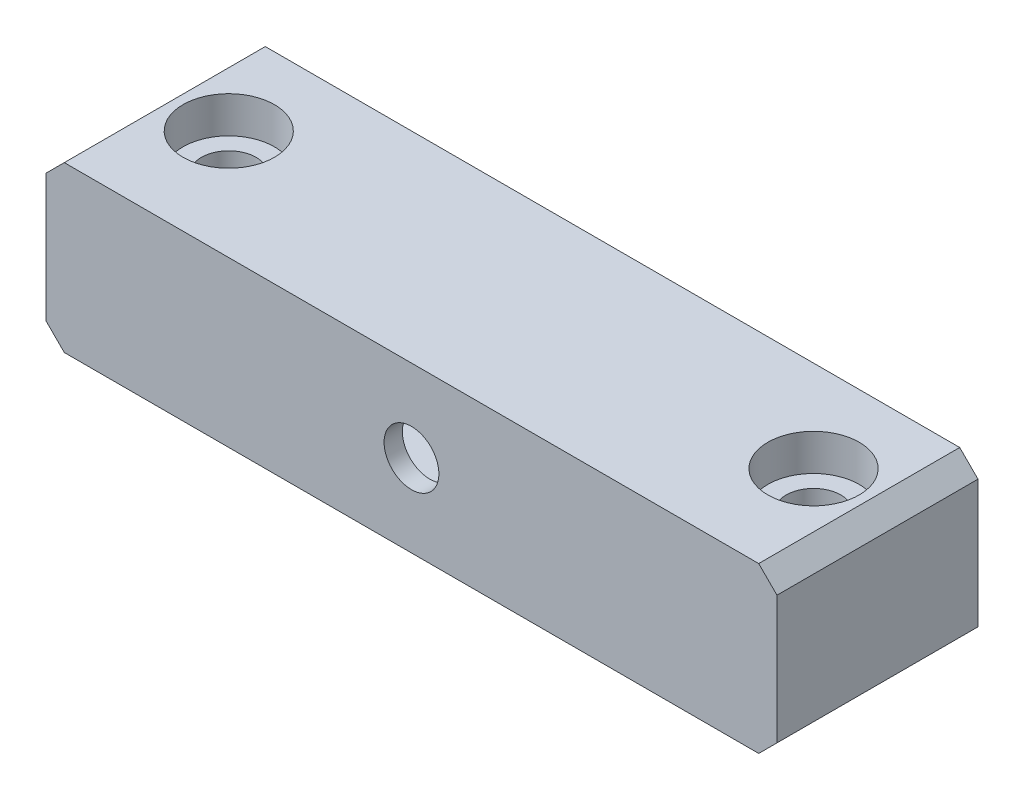
ISO-10303-21;
HEADER;
FILE_DESCRIPTION(('STEP AP214'),'2;1');
FILE_NAME('part.step','',(''),(''),'','','');
FILE_SCHEMA(('AUTOMOTIVE_DESIGN { 1 0 10303 214 1 1 1 1 }'));
ENDSEC;
DATA;
#1=APPLICATION_CONTEXT('core data for automotive mechanical design processes');
#2=APPLICATION_PROTOCOL_DEFINITION('international standard','automotive_design',2000,#1);
#3=PRODUCT_CONTEXT('',#1,'mechanical');
#4=PRODUCT('Part','Part','',(#3));
#5=PRODUCT_RELATED_PRODUCT_CATEGORY('part','',(#4));
#6=PRODUCT_DEFINITION_FORMATION('','',#4);
#7=PRODUCT_DEFINITION_CONTEXT('part definition',#1,'design');
#8=PRODUCT_DEFINITION('design','',#6,#7);
#9=PRODUCT_DEFINITION_SHAPE('','',#8);
#10=(LENGTH_UNIT() NAMED_UNIT(*) SI_UNIT(.MILLI.,.METRE.));
#11=(NAMED_UNIT(*) PLANE_ANGLE_UNIT() SI_UNIT($,.RADIAN.));
#12=(NAMED_UNIT(*) SI_UNIT($,.STERADIAN.) SOLID_ANGLE_UNIT());
#13=UNCERTAINTY_MEASURE_WITH_UNIT(LENGTH_MEASURE(1.E-05),#10,'distance_accuracy_value','');
#14=(GEOMETRIC_REPRESENTATION_CONTEXT(3) GLOBAL_UNCERTAINTY_ASSIGNED_CONTEXT((#13)) GLOBAL_UNIT_ASSIGNED_CONTEXT((#10,
#11,#12)) REPRESENTATION_CONTEXT('',''));
#15=CARTESIAN_POINT('',(0.,0.,0.));
#16=DIRECTION('',(0.,0.,1.));
#17=DIRECTION('',(1.,0.,0.));
#18=AXIS2_PLACEMENT_3D('',#15,#16,#17);
#19=CARTESIAN_POINT('',(0.,0.,-5.));
#20=DIRECTION('',(0.,0.,1.));
#21=DIRECTION('',(1.,0.,0.));
#22=AXIS2_PLACEMENT_3D('',#19,#20,#21);
#23=PLANE('',#22);
#24=DIRECTION('',(1.,0.,0.));
#25=VECTOR('',#24,1.);
#26=CARTESIAN_POINT('',(10.,-4.5,-5.));
#27=LINE('',#26,#25);
#28=CARTESIAN_POINT('',(-19.,-4.5,-5.));
#29=VERTEX_POINT('',#28);
#30=CARTESIAN_POINT('',(19.,-4.5,-5.));
#31=VERTEX_POINT('',#30);
#32=EDGE_CURVE('E183',#29,#31,#27,.T.);
#33=ORIENTED_EDGE('',*,*,#32,.F.);
#34=DIRECTION('',(0.707106781186546,-0.707106781186549,0.));
#35=VECTOR('',#34,1.);
#36=CARTESIAN_POINT('',(-19.,-4.5,-5.));
#37=LINE('',#36,#35);
#38=CARTESIAN_POINT('',(-20.,-3.49999999999999,-5.));
#39=VERTEX_POINT('',#38);
#40=EDGE_CURVE('E210',#29,#39,#37,.F.);
#41=ORIENTED_EDGE('',*,*,#40,.T.);
#42=DIRECTION('',(0.,-1.,0.));
#43=VECTOR('',#42,1.);
#44=CARTESIAN_POINT('',(-20.,4.5,-5.));
#45=LINE('',#44,#43);
#46=CARTESIAN_POINT('',(-20.,3.5,-5.));
#47=VERTEX_POINT('',#46);
#48=EDGE_CURVE('E175',#47,#39,#45,.T.);
#49=ORIENTED_EDGE('',*,*,#48,.F.);
#50=DIRECTION('',(-0.707106781186549,-0.707106781186546,0.));
#51=VECTOR('',#50,1.);
#52=CARTESIAN_POINT('',(-20.,3.5,-5.));
#53=LINE('',#52,#51);
#54=CARTESIAN_POINT('',(-19.,4.5,-5.));
#55=VERTEX_POINT('',#54);
#56=EDGE_CURVE('E204',#47,#55,#53,.F.);
#57=ORIENTED_EDGE('',*,*,#56,.T.);
#58=DIRECTION('',(-1.,0.,0.));
#59=VECTOR('',#58,1.);
#60=CARTESIAN_POINT('',(-10.,4.5,-5.));
#61=LINE('',#60,#59);
#62=CARTESIAN_POINT('',(19.,4.5,-5.));
#63=VERTEX_POINT('',#62);
#64=EDGE_CURVE('E189',#63,#55,#61,.T.);
#65=ORIENTED_EDGE('',*,*,#64,.F.);
#66=DIRECTION('',(-0.707106781186545,0.70710678118655,0.));
#67=VECTOR('',#66,1.);
#68=CARTESIAN_POINT('',(19.,4.5,-5.));
#69=LINE('',#68,#67);
#70=CARTESIAN_POINT('',(20.,3.5,-5.));
#71=VERTEX_POINT('',#70);
#72=EDGE_CURVE('E206',#63,#71,#69,.F.);
#73=ORIENTED_EDGE('',*,*,#72,.T.);
#74=DIRECTION('',(0.,1.,0.));
#75=VECTOR('',#74,1.);
#76=CARTESIAN_POINT('',(20.,-4.5,-5.));
#77=LINE('',#76,#75);
#78=CARTESIAN_POINT('',(20.,-3.50000000000001,-5.));
#79=VERTEX_POINT('',#78);
#80=EDGE_CURVE('E186',#79,#71,#77,.T.);
#81=ORIENTED_EDGE('',*,*,#80,.F.);
#82=DIRECTION('',(0.707106781186549,0.707106781186546,0.));
#83=VECTOR('',#82,1.);
#84=CARTESIAN_POINT('',(20.,-3.50000000000001,-5.));
#85=LINE('',#84,#83);
#86=EDGE_CURVE('E208',#79,#31,#85,.F.);
#87=ORIENTED_EDGE('',*,*,#86,.T.);
#88=EDGE_LOOP('',(#33,#41,#49,#57,#65,#73,#81,#87));
#89=FACE_BOUND('',#88,.T.);
#90=CARTESIAN_POINT('',(-10.,0.,-5.));
#91=DIRECTION('',(0.,0.,1.));
#92=DIRECTION('',(-1.,0.,0.));
#93=AXIS2_PLACEMENT_3D('',#90,#91,#92);
#94=CIRCLE('',#93,3.5);
#95=CARTESIAN_POINT('',(-10.,3.5,-5.));
#96=VERTEX_POINT('',#95);
#97=CARTESIAN_POINT('',(-10.,-3.5,-5.));
#98=VERTEX_POINT('',#97);
#99=EDGE_CURVE('E258',#96,#98,#94,.T.);
#100=ORIENTED_EDGE('',*,*,#99,.T.);
#101=DIRECTION('',(1.,0.,0.));
#102=VECTOR('',#101,1.);
#103=CARTESIAN_POINT('',(10.,-3.5,-5.));
#104=LINE('',#103,#102);
#105=CARTESIAN_POINT('',(10.,-3.5,-5.));
#106=VERTEX_POINT('',#105);
#107=EDGE_CURVE('E264',#98,#106,#104,.T.);
#108=ORIENTED_EDGE('',*,*,#107,.T.);
#109=CARTESIAN_POINT('',(10.,0.,-5.));
#110=DIRECTION('',(0.,0.,1.));
#111=DIRECTION('',(-1.,0.,0.));
#112=AXIS2_PLACEMENT_3D('',#109,#110,#111);
#113=CIRCLE('',#112,3.5);
#114=CARTESIAN_POINT('',(10.,3.5,-5.));
#115=VERTEX_POINT('',#114);
#116=EDGE_CURVE('E171',#106,#115,#113,.T.);
#117=ORIENTED_EDGE('',*,*,#116,.T.);
#118=DIRECTION('',(-1.,0.,0.));
#119=VECTOR('',#118,1.);
#120=CARTESIAN_POINT('',(-10.,3.5,-5.));
#121=LINE('',#120,#119);
#122=EDGE_CURVE('E259',#115,#96,#121,.T.);
#123=ORIENTED_EDGE('',*,*,#122,.T.);
#124=EDGE_LOOP('',(#100,#108,#117,#123));
#125=FACE_BOUND('',#124,.T.);
#126=ADVANCED_FACE('F59',(#89,#125),#23,.F.);
#127=CARTESIAN_POINT('',(-20.,4.5,5.));
#128=DIRECTION('',(1.,0.,0.));
#129=DIRECTION('',(0.,1.,0.));
#130=AXIS2_PLACEMENT_3D('',#127,#128,#129);
#131=PLANE('',#130);
#132=ORIENTED_EDGE('',*,*,#48,.T.);
#133=DIRECTION('',(0.,0.,1.));
#134=VECTOR('',#133,1.);
#135=CARTESIAN_POINT('',(-20.,-3.49999999999999,5.));
#136=LINE('',#135,#134);
#137=CARTESIAN_POINT('',(-20.,-3.49999999999999,6.));
#138=VERTEX_POINT('',#137);
#139=EDGE_CURVE('E215',#39,#138,#136,.T.);
#140=ORIENTED_EDGE('',*,*,#139,.T.);
#141=DIRECTION('',(0.,-1.,0.));
#142=VECTOR('',#141,1.);
#143=CARTESIAN_POINT('',(-20.,0.,6.));
#144=LINE('',#143,#142);
#145=CARTESIAN_POINT('',(-20.,3.5,6.));
#146=VERTEX_POINT('',#145);
#147=EDGE_CURVE('E247',#146,#138,#144,.T.);
#148=ORIENTED_EDGE('',*,*,#147,.F.);
#149=DIRECTION('',(0.,0.,-1.));
#150=VECTOR('',#149,1.);
#151=CARTESIAN_POINT('',(-20.,3.5,5.));
#152=LINE('',#151,#150);
#153=EDGE_CURVE('E212',#146,#47,#152,.T.);
#154=ORIENTED_EDGE('',*,*,#153,.T.);
#155=EDGE_LOOP('',(#132,#140,#148,#154));
#156=FACE_BOUND('',#155,.T.);
#157=ADVANCED_FACE('F286',(#156),#131,.F.);
#158=CARTESIAN_POINT('',(10.,-4.5,5.));
#159=DIRECTION('',(0.,1.,0.));
#160=DIRECTION('',(-1.,0.,0.));
#161=AXIS2_PLACEMENT_3D('',#158,#159,#160);
#162=PLANE('',#161);
#163=CARTESIAN_POINT('',(-16.,-4.5,0.));
#164=DIRECTION('',(0.,1.,0.));
#165=DIRECTION('',(0.,0.,1.));
#166=AXIS2_PLACEMENT_3D('',#163,#164,#165);
#167=CIRCLE('',#166,1.5);
#168=CARTESIAN_POINT('',(-16.,-4.5,1.5));
#169=VERTEX_POINT('',#168);
#170=EDGE_CURVE('E196',#169,#169,#167,.T.);
#171=ORIENTED_EDGE('',*,*,#170,.T.);
#172=EDGE_LOOP('',(#171));
#173=FACE_BOUND('',#172,.T.);
#174=CARTESIAN_POINT('',(16.,-4.5,0.));
#175=DIRECTION('',(0.,1.,0.));
#176=DIRECTION('',(0.,0.,1.));
#177=AXIS2_PLACEMENT_3D('',#174,#175,#176);
#178=CIRCLE('',#177,1.5);
#179=CARTESIAN_POINT('',(16.,-4.5,1.5));
#180=VERTEX_POINT('',#179);
#181=EDGE_CURVE('E468',#180,#180,#178,.T.);
#182=ORIENTED_EDGE('',*,*,#181,.T.);
#183=EDGE_LOOP('',(#182));
#184=FACE_BOUND('',#183,.T.);
#185=DIRECTION('',(1.,0.,0.));
#186=VECTOR('',#185,1.);
#187=CARTESIAN_POINT('',(0.,-4.5,6.));
#188=LINE('',#187,#186);
#189=CARTESIAN_POINT('',(-19.,-4.5,6.));
#190=VERTEX_POINT('',#189);
#191=CARTESIAN_POINT('',(19.,-4.5,6.));
#192=VERTEX_POINT('',#191);
#193=EDGE_CURVE('E250',#190,#192,#188,.T.);
#194=ORIENTED_EDGE('',*,*,#193,.F.);
#195=DIRECTION('',(0.,0.,-1.));
#196=VECTOR('',#195,1.);
#197=CARTESIAN_POINT('',(-19.,-4.5,5.));
#198=LINE('',#197,#196);
#199=EDGE_CURVE('E201',#190,#29,#198,.T.);
#200=ORIENTED_EDGE('',*,*,#199,.T.);
#201=ORIENTED_EDGE('',*,*,#32,.T.);
#202=DIRECTION('',(0.,0.,1.));
#203=VECTOR('',#202,1.);
#204=CARTESIAN_POINT('',(19.,-4.5,5.));
#205=LINE('',#204,#203);
#206=EDGE_CURVE('E191',#31,#192,#205,.T.);
#207=ORIENTED_EDGE('',*,*,#206,.T.);
#208=EDGE_LOOP('',(#194,#200,#201,#207));
#209=FACE_BOUND('',#208,.T.);
#210=ADVANCED_FACE('F290',(#173,#184,#209),#162,.F.);
#211=CARTESIAN_POINT('',(20.,-4.5,5.));
#212=DIRECTION('',(-1.,0.,0.));
#213=DIRECTION('',(0.,-1.,0.));
#214=AXIS2_PLACEMENT_3D('',#211,#212,#213);
#215=PLANE('',#214);
#216=DIRECTION('',(0.,1.,0.));
#217=VECTOR('',#216,1.);
#218=CARTESIAN_POINT('',(20.,0.,6.));
#219=LINE('',#218,#217);
#220=CARTESIAN_POINT('',(20.,-3.50000000000001,6.));
#221=VERTEX_POINT('',#220);
#222=CARTESIAN_POINT('',(20.,3.5,6.));
#223=VERTEX_POINT('',#222);
#224=EDGE_CURVE('E234',#221,#223,#219,.T.);
#225=ORIENTED_EDGE('',*,*,#224,.F.);
#226=DIRECTION('',(0.,0.,-1.));
#227=VECTOR('',#226,1.);
#228=CARTESIAN_POINT('',(20.,-3.50000000000001,5.));
#229=LINE('',#228,#227);
#230=EDGE_CURVE('E226',#221,#79,#229,.T.);
#231=ORIENTED_EDGE('',*,*,#230,.T.);
#232=ORIENTED_EDGE('',*,*,#80,.T.);
#233=DIRECTION('',(0.,0.,1.));
#234=VECTOR('',#233,1.);
#235=CARTESIAN_POINT('',(20.,3.5,5.));
#236=LINE('',#235,#234);
#237=EDGE_CURVE('E224',#71,#223,#236,.T.);
#238=ORIENTED_EDGE('',*,*,#237,.T.);
#239=EDGE_LOOP('',(#225,#231,#232,#238));
#240=FACE_BOUND('',#239,.T.);
#241=ADVANCED_FACE('F232',(#240),#215,.F.);
#242=CARTESIAN_POINT('',(-10.,4.5,5.));
#243=DIRECTION('',(0.,-1.,0.));
#244=DIRECTION('',(0.,0.,-1.));
#245=AXIS2_PLACEMENT_3D('',#242,#243,#244);
#246=PLANE('',#245);
#247=CARTESIAN_POINT('',(16.,4.5,0.));
#248=DIRECTION('',(0.,1.,0.));
#249=DIRECTION('',(0.,0.,1.));
#250=AXIS2_PLACEMENT_3D('',#247,#248,#249);
#251=CIRCLE('',#250,2.5);
#252=CARTESIAN_POINT('',(16.,4.5,2.5));
#253=VERTEX_POINT('',#252);
#254=EDGE_CURVE('E477',#253,#253,#251,.T.);
#255=ORIENTED_EDGE('',*,*,#254,.F.);
#256=EDGE_LOOP('',(#255));
#257=FACE_BOUND('',#256,.T.);
#258=CARTESIAN_POINT('',(-16.,4.5,0.));
#259=DIRECTION('',(0.,1.,0.));
#260=DIRECTION('',(0.,0.,1.));
#261=AXIS2_PLACEMENT_3D('',#258,#259,#260);
#262=CIRCLE('',#261,2.5);
#263=CARTESIAN_POINT('',(-16.,4.5,2.5));
#264=VERTEX_POINT('',#263);
#265=EDGE_CURVE('E480',#264,#264,#262,.T.);
#266=ORIENTED_EDGE('',*,*,#265,.F.);
#267=EDGE_LOOP('',(#266));
#268=FACE_BOUND('',#267,.T.);
#269=DIRECTION('',(-1.,0.,0.));
#270=VECTOR('',#269,1.);
#271=CARTESIAN_POINT('',(0.,4.50000000000001,6.));
#272=LINE('',#271,#270);
#273=CARTESIAN_POINT('',(19.,4.5,6.));
#274=VERTEX_POINT('',#273);
#275=CARTESIAN_POINT('',(-19.,4.50000000000002,6.));
#276=VERTEX_POINT('',#275);
#277=EDGE_CURVE('E245',#274,#276,#272,.T.);
#278=ORIENTED_EDGE('',*,*,#277,.F.);
#279=DIRECTION('',(0.,0.,-1.));
#280=VECTOR('',#279,1.);
#281=CARTESIAN_POINT('',(19.,4.5,5.));
#282=LINE('',#281,#280);
#283=EDGE_CURVE('E14',#274,#63,#282,.T.);
#284=ORIENTED_EDGE('',*,*,#283,.T.);
#285=ORIENTED_EDGE('',*,*,#64,.T.);
#286=DIRECTION('',(0.,0.,1.));
#287=VECTOR('',#286,1.);
#288=CARTESIAN_POINT('',(-19.,4.5,5.));
#289=LINE('',#288,#287);
#290=EDGE_CURVE('E68',#55,#276,#289,.T.);
#291=ORIENTED_EDGE('',*,*,#290,.T.);
#292=EDGE_LOOP('',(#278,#284,#285,#291));
#293=FACE_BOUND('',#292,.T.);
#294=ADVANCED_FACE('F244',(#257,#268,#293),#246,.F.);
#295=CARTESIAN_POINT('',(-10.,0.,5.));
#296=DIRECTION('',(0.,0.,-1.));
#297=DIRECTION('',(-1.,0.,0.));
#298=AXIS2_PLACEMENT_3D('',#295,#296,#297);
#299=CYLINDRICAL_SURFACE('',#298,3.5);
#300=ORIENTED_EDGE('',*,*,#99,.F.);
#301=DIRECTION('',(0.,0.,-1.));
#302=VECTOR('',#301,1.);
#303=CARTESIAN_POINT('',(-10.,3.5,5.));
#304=LINE('',#303,#302);
#305=CARTESIAN_POINT('',(-10.,3.5,5.));
#306=VERTEX_POINT('',#305);
#307=EDGE_CURVE('E177',#306,#96,#304,.T.);
#308=ORIENTED_EDGE('',*,*,#307,.F.);
#309=CARTESIAN_POINT('',(-10.,0.,5.));
#310=DIRECTION('',(0.,0.,1.));
#311=DIRECTION('',(-1.,0.,0.));
#312=AXIS2_PLACEMENT_3D('',#309,#310,#311);
#313=CIRCLE('',#312,3.5);
#314=CARTESIAN_POINT('',(-10.,-3.5,5.));
#315=VERTEX_POINT('',#314);
#316=EDGE_CURVE('E167',#306,#315,#313,.T.);
#317=ORIENTED_EDGE('',*,*,#316,.T.);
#318=DIRECTION('',(0.,0.,-1.));
#319=VECTOR('',#318,1.);
#320=CARTESIAN_POINT('',(-10.,-3.5,5.));
#321=LINE('',#320,#319);
#322=EDGE_CURVE('E166',#315,#98,#321,.T.);
#323=ORIENTED_EDGE('',*,*,#322,.T.);
#324=EDGE_LOOP('',(#300,#308,#317,#323));
#325=FACE_BOUND('',#324,.T.);
#326=ADVANCED_FACE('F274',(#325),#299,.F.);
#327=CARTESIAN_POINT('',(10.,-3.5,5.));
#328=DIRECTION('',(0.,1.,0.));
#329=DIRECTION('',(0.,0.,1.));
#330=AXIS2_PLACEMENT_3D('',#327,#328,#329);
#331=PLANE('',#330);
#332=ORIENTED_EDGE('',*,*,#107,.F.);
#333=ORIENTED_EDGE('',*,*,#322,.F.);
#334=DIRECTION('',(1.,0.,0.));
#335=VECTOR('',#334,1.);
#336=CARTESIAN_POINT('',(10.,-3.5,5.));
#337=LINE('',#336,#335);
#338=CARTESIAN_POINT('',(10.,-3.5,5.));
#339=VERTEX_POINT('',#338);
#340=EDGE_CURVE('E152',#315,#339,#337,.T.);
#341=ORIENTED_EDGE('',*,*,#340,.T.);
#342=DIRECTION('',(0.,0.,-1.));
#343=VECTOR('',#342,1.);
#344=CARTESIAN_POINT('',(10.,-3.5,5.));
#345=LINE('',#344,#343);
#346=EDGE_CURVE('E163',#339,#106,#345,.T.);
#347=ORIENTED_EDGE('',*,*,#346,.T.);
#348=EDGE_LOOP('',(#332,#333,#341,#347));
#349=FACE_BOUND('',#348,.T.);
#350=ADVANCED_FACE('F162',(#349),#331,.T.);
#351=CARTESIAN_POINT('',(10.,0.,5.));
#352=DIRECTION('',(0.,0.,-1.));
#353=DIRECTION('',(-1.,0.,0.));
#354=AXIS2_PLACEMENT_3D('',#351,#352,#353);
#355=CYLINDRICAL_SURFACE('',#354,3.5);
#356=ORIENTED_EDGE('',*,*,#116,.F.);
#357=ORIENTED_EDGE('',*,*,#346,.F.);
#358=CARTESIAN_POINT('',(10.,0.,5.));
#359=DIRECTION('',(0.,0.,1.));
#360=DIRECTION('',(-1.,0.,0.));
#361=AXIS2_PLACEMENT_3D('',#358,#359,#360);
#362=CIRCLE('',#361,3.5);
#363=CARTESIAN_POINT('',(10.,3.5,5.));
#364=VERTEX_POINT('',#363);
#365=EDGE_CURVE('E149',#339,#364,#362,.T.);
#366=ORIENTED_EDGE('',*,*,#365,.T.);
#367=DIRECTION('',(0.,0.,-1.));
#368=VECTOR('',#367,1.);
#369=CARTESIAN_POINT('',(10.,3.5,5.));
#370=LINE('',#369,#368);
#371=EDGE_CURVE('E173',#364,#115,#370,.T.);
#372=ORIENTED_EDGE('',*,*,#371,.T.);
#373=EDGE_LOOP('',(#356,#357,#366,#372));
#374=FACE_BOUND('',#373,.T.);
#375=ADVANCED_FACE('F169',(#374),#355,.F.);
#376=CARTESIAN_POINT('',(-10.,3.5,5.));
#377=DIRECTION('',(0.,-1.,0.));
#378=DIRECTION('',(1.,0.,0.));
#379=AXIS2_PLACEMENT_3D('',#376,#377,#378);
#380=PLANE('',#379);
#381=ORIENTED_EDGE('',*,*,#122,.F.);
#382=ORIENTED_EDGE('',*,*,#371,.F.);
#383=DIRECTION('',(-1.,0.,0.));
#384=VECTOR('',#383,1.);
#385=CARTESIAN_POINT('',(-10.,3.5,5.));
#386=LINE('',#385,#384);
#387=EDGE_CURVE('E155',#364,#306,#386,.T.);
#388=ORIENTED_EDGE('',*,*,#387,.T.);
#389=ORIENTED_EDGE('',*,*,#307,.T.);
#390=EDGE_LOOP('',(#381,#382,#388,#389));
#391=FACE_BOUND('',#390,.T.);
#392=ADVANCED_FACE('F272',(#391),#380,.T.);
#393=CARTESIAN_POINT('',(0.,0.,5.));
#394=DIRECTION('',(0.,0.,1.));
#395=DIRECTION('',(1.,0.,0.));
#396=AXIS2_PLACEMENT_3D('',#393,#394,#395);
#397=PLANE('',#396);
#398=CARTESIAN_POINT('',(0.,0.,5.));
#399=DIRECTION('',(0.,0.,1.));
#400=DIRECTION('',(1.,0.,0.));
#401=AXIS2_PLACEMENT_3D('',#398,#399,#400);
#402=CIRCLE('',#401,1.5);
#403=CARTESIAN_POINT('',(1.5,0.,5.));
#404=VERTEX_POINT('',#403);
#405=EDGE_CURVE('E252',#404,#404,#402,.F.);
#406=ORIENTED_EDGE('',*,*,#405,.F.);
#407=EDGE_LOOP('',(#406));
#408=FACE_BOUND('',#407,.T.);
#409=ORIENTED_EDGE('',*,*,#340,.F.);
#410=ORIENTED_EDGE('',*,*,#316,.F.);
#411=ORIENTED_EDGE('',*,*,#387,.F.);
#412=ORIENTED_EDGE('',*,*,#365,.F.);
#413=EDGE_LOOP('',(#409,#410,#411,#412));
#414=FACE_BOUND('',#413,.T.);
#415=ADVANCED_FACE('F151',(#408,#414),#397,.F.);
#416=CARTESIAN_POINT('',(0.,0.,6.));
#417=DIRECTION('',(0.,0.,1.));
#418=DIRECTION('',(1.,0.,0.));
#419=AXIS2_PLACEMENT_3D('',#416,#417,#418);
#420=PLANE('',#419);
#421=CARTESIAN_POINT('',(0.,0.,6.));
#422=DIRECTION('',(0.,0.,1.));
#423=DIRECTION('',(1.,0.,0.));
#424=AXIS2_PLACEMENT_3D('',#421,#422,#423);
#425=CIRCLE('',#424,1.5);
#426=CARTESIAN_POINT('',(1.5,0.,6.));
#427=VERTEX_POINT('',#426);
#428=EDGE_CURVE('E476',#427,#427,#425,.T.);
#429=ORIENTED_EDGE('',*,*,#428,.F.);
#430=EDGE_LOOP('',(#429));
#431=FACE_BOUND('',#430,.T.);
#432=ORIENTED_EDGE('',*,*,#147,.T.);
#433=DIRECTION('',(-0.707106781186546,0.707106781186549,0.));
#434=VECTOR('',#433,1.);
#435=CARTESIAN_POINT('',(-11.7500000000001,-11.75,6.));
#436=LINE('',#435,#434);
#437=EDGE_CURVE('E222',#138,#190,#436,.F.);
#438=ORIENTED_EDGE('',*,*,#437,.T.);
#439=ORIENTED_EDGE('',*,*,#193,.T.);
#440=DIRECTION('',(-0.707106781186549,-0.707106781186546,0.));
#441=VECTOR('',#440,1.);
#442=CARTESIAN_POINT('',(11.75,-11.75,6.));
#443=LINE('',#442,#441);
#444=EDGE_CURVE('E220',#192,#221,#443,.F.);
#445=ORIENTED_EDGE('',*,*,#444,.T.);
#446=ORIENTED_EDGE('',*,*,#224,.T.);
#447=DIRECTION('',(0.707106781186545,-0.70710678118655,0.));
#448=VECTOR('',#447,1.);
#449=CARTESIAN_POINT('',(11.7500000000001,11.75,6.));
#450=LINE('',#449,#448);
#451=EDGE_CURVE('E81',#223,#274,#450,.F.);
#452=ORIENTED_EDGE('',*,*,#451,.T.);
#453=ORIENTED_EDGE('',*,*,#277,.T.);
#454=DIRECTION('',(0.707106781186549,0.707106781186546,0.));
#455=VECTOR('',#454,1.);
#456=CARTESIAN_POINT('',(-11.75,11.75,6.));
#457=LINE('',#456,#455);
#458=EDGE_CURVE('E217',#276,#146,#457,.F.);
#459=ORIENTED_EDGE('',*,*,#458,.T.);
#460=EDGE_LOOP('',(#432,#438,#439,#445,#446,#452,#453,#459));
#461=FACE_BOUND('',#460,.T.);
#462=ADVANCED_FACE('F324',(#431,#461),#420,.T.);
#463=CARTESIAN_POINT('',(0.,0.,-5.001));
#464=DIRECTION('',(0.,0.,1.));
#465=DIRECTION('',(1.,0.,0.));
#466=AXIS2_PLACEMENT_3D('',#463,#464,#465);
#467=CYLINDRICAL_SURFACE('',#466,1.5);
#468=ORIENTED_EDGE('',*,*,#428,.T.);
#469=EDGE_LOOP('',(#468));
#470=FACE_BOUND('',#469,.T.);
#471=ORIENTED_EDGE('',*,*,#405,.T.);
#472=EDGE_LOOP('',(#471));
#473=FACE_BOUND('',#472,.T.);
#474=ADVANCED_FACE('F333',(#470,#473),#467,.F.);
#475=CARTESIAN_POINT('',(-16.,2.5,0.));
#476=DIRECTION('',(0.,1.,0.));
#477=DIRECTION('',(0.,0.,1.));
#478=AXIS2_PLACEMENT_3D('',#475,#476,#477);
#479=CYLINDRICAL_SURFACE('',#478,2.5);
#480=CARTESIAN_POINT('',(-16.,2.5,0.));
#481=DIRECTION('',(0.,1.,0.));
#482=DIRECTION('',(0.,0.,1.));
#483=AXIS2_PLACEMENT_3D('',#480,#481,#482);
#484=CIRCLE('',#483,2.5);
#485=CARTESIAN_POINT('',(-16.,2.5,2.5));
#486=VERTEX_POINT('',#485);
#487=EDGE_CURVE('E199',#486,#486,#484,.T.);
#488=ORIENTED_EDGE('',*,*,#487,.F.);
#489=EDGE_LOOP('',(#488));
#490=FACE_BOUND('',#489,.T.);
#491=ORIENTED_EDGE('',*,*,#265,.T.);
#492=EDGE_LOOP('',(#491));
#493=FACE_BOUND('',#492,.T.);
#494=ADVANCED_FACE('F340',(#490,#493),#479,.F.);
#495=CARTESIAN_POINT('',(0.,2.5,0.));
#496=DIRECTION('',(0.,1.,0.));
#497=DIRECTION('',(0.,0.,1.));
#498=AXIS2_PLACEMENT_3D('',#495,#496,#497);
#499=PLANE('',#498);
#500=CARTESIAN_POINT('',(-16.,2.5,0.));
#501=DIRECTION('',(0.,1.,0.));
#502=DIRECTION('',(0.,0.,1.));
#503=AXIS2_PLACEMENT_3D('',#500,#501,#502);
#504=CIRCLE('',#503,1.5);
#505=CARTESIAN_POINT('',(-16.,2.5,1.5));
#506=VERTEX_POINT('',#505);
#507=EDGE_CURVE('E195',#506,#506,#504,.T.);
#508=ORIENTED_EDGE('',*,*,#507,.F.);
#509=EDGE_LOOP('',(#508));
#510=FACE_BOUND('',#509,.T.);
#511=ORIENTED_EDGE('',*,*,#487,.T.);
#512=EDGE_LOOP('',(#511));
#513=FACE_BOUND('',#512,.T.);
#514=ADVANCED_FACE('F390',(#510,#513),#499,.T.);
#515=CARTESIAN_POINT('',(16.,2.5,0.));
#516=DIRECTION('',(0.,1.,0.));
#517=DIRECTION('',(0.,0.,1.));
#518=AXIS2_PLACEMENT_3D('',#515,#516,#517);
#519=CYLINDRICAL_SURFACE('',#518,2.5);
#520=CARTESIAN_POINT('',(16.,2.5,0.));
#521=DIRECTION('',(0.,1.,0.));
#522=DIRECTION('',(0.,0.,1.));
#523=AXIS2_PLACEMENT_3D('',#520,#521,#522);
#524=CIRCLE('',#523,2.5);
#525=CARTESIAN_POINT('',(16.,2.5,2.5));
#526=VERTEX_POINT('',#525);
#527=EDGE_CURVE('E473',#526,#526,#524,.T.);
#528=ORIENTED_EDGE('',*,*,#527,.F.);
#529=EDGE_LOOP('',(#528));
#530=FACE_BOUND('',#529,.T.);
#531=ORIENTED_EDGE('',*,*,#254,.T.);
#532=EDGE_LOOP('',(#531));
#533=FACE_BOUND('',#532,.T.);
#534=ADVANCED_FACE('F403',(#530,#533),#519,.F.);
#535=CARTESIAN_POINT('',(0.,2.5,0.));
#536=DIRECTION('',(0.,1.,0.));
#537=DIRECTION('',(0.,0.,1.));
#538=AXIS2_PLACEMENT_3D('',#535,#536,#537);
#539=PLANE('',#538);
#540=CARTESIAN_POINT('',(16.,2.5,0.));
#541=DIRECTION('',(0.,1.,0.));
#542=DIRECTION('',(0.,0.,1.));
#543=AXIS2_PLACEMENT_3D('',#540,#541,#542);
#544=CIRCLE('',#543,1.5);
#545=CARTESIAN_POINT('',(16.,2.5,1.5));
#546=VERTEX_POINT('',#545);
#547=EDGE_CURVE('E192',#546,#546,#544,.T.);
#548=ORIENTED_EDGE('',*,*,#547,.F.);
#549=EDGE_LOOP('',(#548));
#550=FACE_BOUND('',#549,.T.);
#551=ORIENTED_EDGE('',*,*,#527,.T.);
#552=EDGE_LOOP('',(#551));
#553=FACE_BOUND('',#552,.T.);
#554=ADVANCED_FACE('F412',(#550,#553),#539,.T.);
#555=CARTESIAN_POINT('',(16.,-4.5,0.));
#556=DIRECTION('',(0.,1.,0.));
#557=DIRECTION('',(0.,0.,1.));
#558=AXIS2_PLACEMENT_3D('',#555,#556,#557);
#559=CYLINDRICAL_SURFACE('',#558,1.5);
#560=ORIENTED_EDGE('',*,*,#547,.T.);
#561=EDGE_LOOP('',(#560));
#562=FACE_BOUND('',#561,.T.);
#563=ORIENTED_EDGE('',*,*,#181,.F.);
#564=EDGE_LOOP('',(#563));
#565=FACE_BOUND('',#564,.T.);
#566=ADVANCED_FACE('F422',(#562,#565),#559,.F.);
#567=CARTESIAN_POINT('',(-16.,-4.5,0.));
#568=DIRECTION('',(0.,1.,0.));
#569=DIRECTION('',(0.,0.,1.));
#570=AXIS2_PLACEMENT_3D('',#567,#568,#569);
#571=CYLINDRICAL_SURFACE('',#570,1.5);
#572=ORIENTED_EDGE('',*,*,#507,.T.);
#573=EDGE_LOOP('',(#572));
#574=FACE_BOUND('',#573,.T.);
#575=ORIENTED_EDGE('',*,*,#170,.F.);
#576=EDGE_LOOP('',(#575));
#577=FACE_BOUND('',#576,.T.);
#578=ADVANCED_FACE('F307',(#574,#577),#571,.F.);
#579=CARTESIAN_POINT('',(-19.,-4.5,5.));
#580=DIRECTION('',(0.707106781186549,0.707106781186546,0.));
#581=DIRECTION('',(0.,0.,-1.));
#582=AXIS2_PLACEMENT_3D('',#579,#580,#581);
#583=PLANE('',#582);
#584=ORIENTED_EDGE('',*,*,#437,.F.);
#585=ORIENTED_EDGE('',*,*,#139,.F.);
#586=ORIENTED_EDGE('',*,*,#40,.F.);
#587=ORIENTED_EDGE('',*,*,#199,.F.);
#588=EDGE_LOOP('',(#584,#585,#586,#587));
#589=FACE_BOUND('',#588,.T.);
#590=ADVANCED_FACE('F300',(#589),#583,.F.);
#591=CARTESIAN_POINT('',(20.,-3.50000000000001,5.));
#592=DIRECTION('',(-0.707106781186546,0.707106781186549,0.));
#593=DIRECTION('',(0.,0.,-1.));
#594=AXIS2_PLACEMENT_3D('',#591,#592,#593);
#595=PLANE('',#594);
#596=ORIENTED_EDGE('',*,*,#444,.F.);
#597=ORIENTED_EDGE('',*,*,#206,.F.);
#598=ORIENTED_EDGE('',*,*,#86,.F.);
#599=ORIENTED_EDGE('',*,*,#230,.F.);
#600=EDGE_LOOP('',(#596,#597,#598,#599));
#601=FACE_BOUND('',#600,.T.);
#602=ADVANCED_FACE('F306',(#601),#595,.F.);
#603=CARTESIAN_POINT('',(19.,4.5,5.));
#604=DIRECTION('',(-0.70710678118655,-0.707106781186545,0.));
#605=DIRECTION('',(0.,0.,-1.));
#606=AXIS2_PLACEMENT_3D('',#603,#604,#605);
#607=PLANE('',#606);
#608=ORIENTED_EDGE('',*,*,#451,.F.);
#609=ORIENTED_EDGE('',*,*,#237,.F.);
#610=ORIENTED_EDGE('',*,*,#72,.F.);
#611=ORIENTED_EDGE('',*,*,#283,.F.);
#612=EDGE_LOOP('',(#608,#609,#610,#611));
#613=FACE_BOUND('',#612,.T.);
#614=ADVANCED_FACE('F243',(#613),#607,.F.);
#615=CARTESIAN_POINT('',(-20.,3.5,5.));
#616=DIRECTION('',(0.707106781186546,-0.707106781186549,0.));
#617=DIRECTION('',(0.,0.,-1.));
#618=AXIS2_PLACEMENT_3D('',#615,#616,#617);
#619=PLANE('',#618);
#620=ORIENTED_EDGE('',*,*,#458,.F.);
#621=ORIENTED_EDGE('',*,*,#290,.F.);
#622=ORIENTED_EDGE('',*,*,#56,.F.);
#623=ORIENTED_EDGE('',*,*,#153,.F.);
#624=EDGE_LOOP('',(#620,#621,#622,#623));
#625=FACE_BOUND('',#624,.T.);
#626=ADVANCED_FACE('F62',(#625),#619,.F.);
#627=CLOSED_SHELL('',(#126,#157,#210,#241,#294,#326,#350,#375,#392,#415,#462,#474,#494,#514,
#534,#554,#566,#578,#590,#602,#614,#626));
#628=MANIFOLD_SOLID_BREP('B2',#627);
#629=ADVANCED_BREP_SHAPE_REPRESENTATION('',(#18,#628),#14);
#630=SHAPE_DEFINITION_REPRESENTATION(#9,#629);
ENDSEC;
END-ISO-10303-21;
